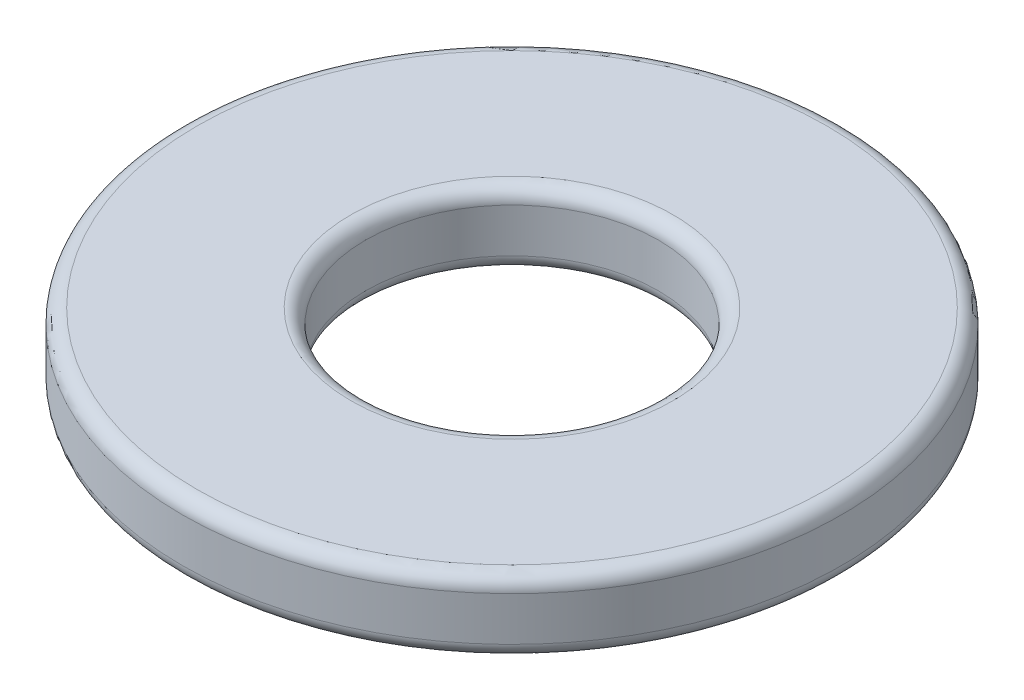
ISO-10303-21;
HEADER;
FILE_DESCRIPTION(('STEP AP214'),'2;1');
FILE_NAME('part.step','',(''),(''),'','','');
FILE_SCHEMA(('AUTOMOTIVE_DESIGN { 1 0 10303 214 1 1 1 1 }'));
ENDSEC;
DATA;
#1=APPLICATION_CONTEXT('core data for automotive mechanical design processes');
#2=APPLICATION_PROTOCOL_DEFINITION('international standard','automotive_design',2000,#1);
#3=PRODUCT_CONTEXT('',#1,'mechanical');
#4=PRODUCT('Part','Part','',(#3));
#5=PRODUCT_RELATED_PRODUCT_CATEGORY('part','',(#4));
#6=PRODUCT_DEFINITION_FORMATION('','',#4);
#7=PRODUCT_DEFINITION_CONTEXT('part definition',#1,'design');
#8=PRODUCT_DEFINITION('design','',#6,#7);
#9=PRODUCT_DEFINITION_SHAPE('','',#8);
#10=(LENGTH_UNIT() NAMED_UNIT(*) SI_UNIT(.MILLI.,.METRE.));
#11=(NAMED_UNIT(*) PLANE_ANGLE_UNIT() SI_UNIT($,.RADIAN.));
#12=(NAMED_UNIT(*) SI_UNIT($,.STERADIAN.) SOLID_ANGLE_UNIT());
#13=UNCERTAINTY_MEASURE_WITH_UNIT(LENGTH_MEASURE(1.E-05),#10,'distance_accuracy_value','');
#14=(GEOMETRIC_REPRESENTATION_CONTEXT(3) GLOBAL_UNCERTAINTY_ASSIGNED_CONTEXT((#13)) GLOBAL_UNIT_ASSIGNED_CONTEXT((#10,
#11,#12)) REPRESENTATION_CONTEXT('',''));
#15=CARTESIAN_POINT('',(0.,0.,0.));
#16=DIRECTION('',(0.,0.,1.));
#17=DIRECTION('',(1.,0.,0.));
#18=AXIS2_PLACEMENT_3D('',#15,#16,#17);
#19=CARTESIAN_POINT('',(0.,1.,0.));
#20=DIRECTION('',(0.,1.,0.));
#21=DIRECTION('',(0.,0.,1.));
#22=AXIS2_PLACEMENT_3D('',#19,#20,#21);
#23=PLANE('',#22);
#24=CARTESIAN_POINT('',(0.,1.,0.));
#25=DIRECTION('',(0.,1.,0.));
#26=DIRECTION('',(0.,0.,1.));
#27=AXIS2_PLACEMENT_3D('',#24,#25,#26);
#28=CIRCLE('',#27,4.3);
#29=CARTESIAN_POINT('',(0.,1.,4.3));
#30=VERTEX_POINT('',#29);
#31=EDGE_CURVE('E46',#30,#30,#28,.T.);
#32=ORIENTED_EDGE('',*,*,#31,.T.);
#33=EDGE_LOOP('',(#32));
#34=FACE_BOUND('',#33,.T.);
#35=CARTESIAN_POINT('',(0.,1.,0.));
#36=DIRECTION('',(0.,1.,0.));
#37=DIRECTION('',(0.,0.,1.));
#38=AXIS2_PLACEMENT_3D('',#35,#36,#37);
#39=CIRCLE('',#38,2.2);
#40=CARTESIAN_POINT('',(0.,1.,2.2));
#41=VERTEX_POINT('',#40);
#42=EDGE_CURVE('E50',#41,#41,#39,.F.);
#43=ORIENTED_EDGE('',*,*,#42,.T.);
#44=EDGE_LOOP('',(#43));
#45=FACE_BOUND('',#44,.T.);
#46=ADVANCED_FACE('F35',(#34,#45),#23,.T.);
#47=CARTESIAN_POINT('',(0.,0.,0.));
#48=DIRECTION('',(0.,1.,0.));
#49=DIRECTION('',(0.,0.,1.));
#50=AXIS2_PLACEMENT_3D('',#47,#48,#49);
#51=PLANE('',#50);
#52=CARTESIAN_POINT('',(0.,0.,0.));
#53=DIRECTION('',(0.,1.,0.));
#54=DIRECTION('',(0.,0.,1.));
#55=AXIS2_PLACEMENT_3D('',#52,#53,#54);
#56=CIRCLE('',#55,4.3);
#57=CARTESIAN_POINT('',(0.,0.,4.3));
#58=VERTEX_POINT('',#57);
#59=EDGE_CURVE('E55',#58,#58,#56,.F.);
#60=ORIENTED_EDGE('',*,*,#59,.T.);
#61=EDGE_LOOP('',(#60));
#62=FACE_BOUND('',#61,.T.);
#63=CARTESIAN_POINT('',(0.,0.,0.));
#64=DIRECTION('',(0.,1.,0.));
#65=DIRECTION('',(0.,0.,1.));
#66=AXIS2_PLACEMENT_3D('',#63,#64,#65);
#67=CIRCLE('',#66,2.2);
#68=CARTESIAN_POINT('',(0.,0.,2.2));
#69=VERTEX_POINT('',#68);
#70=EDGE_CURVE('E58',#69,#69,#67,.T.);
#71=ORIENTED_EDGE('',*,*,#70,.T.);
#72=EDGE_LOOP('',(#71));
#73=FACE_BOUND('',#72,.T.);
#74=ADVANCED_FACE('F80',(#62,#73),#51,.F.);
#75=CARTESIAN_POINT('',(0.,1.,0.));
#76=DIRECTION('',(0.,-1.,0.));
#77=DIRECTION('',(0.,0.,-1.));
#78=AXIS2_PLACEMENT_3D('',#75,#76,#77);
#79=CYLINDRICAL_SURFACE('',#78,4.5);
#80=CARTESIAN_POINT('',(0.,0.2,0.));
#81=DIRECTION('',(0.,1.,0.));
#82=DIRECTION('',(0.,0.,1.));
#83=AXIS2_PLACEMENT_3D('',#80,#81,#82);
#84=CIRCLE('',#83,4.5);
#85=CARTESIAN_POINT('',(0.,0.2,4.5));
#86=VERTEX_POINT('',#85);
#87=EDGE_CURVE('E61',#86,#86,#84,.T.);
#88=ORIENTED_EDGE('',*,*,#87,.T.);
#89=EDGE_LOOP('',(#88));
#90=FACE_BOUND('',#89,.T.);
#91=CARTESIAN_POINT('',(0.,0.8,0.));
#92=DIRECTION('',(0.,1.,0.));
#93=DIRECTION('',(0.,0.,1.));
#94=AXIS2_PLACEMENT_3D('',#91,#92,#93);
#95=CIRCLE('',#94,4.5);
#96=CARTESIAN_POINT('',(0.,0.8,4.5));
#97=VERTEX_POINT('',#96);
#98=EDGE_CURVE('E64',#97,#97,#95,.F.);
#99=ORIENTED_EDGE('',*,*,#98,.T.);
#100=EDGE_LOOP('',(#99));
#101=FACE_BOUND('',#100,.T.);
#102=ADVANCED_FACE('F68',(#90,#101),#79,.T.);
#103=CARTESIAN_POINT('',(0.,1.,0.));
#104=DIRECTION('',(0.,-1.,0.));
#105=DIRECTION('',(0.,0.,-1.));
#106=AXIS2_PLACEMENT_3D('',#103,#104,#105);
#107=CYLINDRICAL_SURFACE('',#106,2.);
#108=CARTESIAN_POINT('',(0.,0.2,0.));
#109=DIRECTION('',(0.,1.,0.));
#110=DIRECTION('',(0.,0.,1.));
#111=AXIS2_PLACEMENT_3D('',#108,#109,#110);
#112=CIRCLE('',#111,2.);
#113=CARTESIAN_POINT('',(0.,0.2,2.));
#114=VERTEX_POINT('',#113);
#115=EDGE_CURVE('E10',#114,#114,#112,.F.);
#116=ORIENTED_EDGE('',*,*,#115,.T.);
#117=EDGE_LOOP('',(#116));
#118=FACE_BOUND('',#117,.T.);
#119=CARTESIAN_POINT('',(0.,0.8,0.));
#120=DIRECTION('',(0.,1.,0.));
#121=DIRECTION('',(0.,0.,1.));
#122=AXIS2_PLACEMENT_3D('',#119,#120,#121);
#123=CIRCLE('',#122,2.);
#124=CARTESIAN_POINT('',(0.,0.8,2.));
#125=VERTEX_POINT('',#124);
#126=EDGE_CURVE('E42',#125,#125,#123,.T.);
#127=ORIENTED_EDGE('',*,*,#126,.T.);
#128=EDGE_LOOP('',(#127));
#129=FACE_BOUND('',#128,.T.);
#130=ADVANCED_FACE('F96',(#118,#129),#107,.F.);
#131=CARTESIAN_POINT('',(0.,0.2,0.));
#132=DIRECTION('',(0.,1.,0.));
#133=DIRECTION('',(0.,0.,1.));
#134=AXIS2_PLACEMENT_3D('',#131,#132,#133);
#135=TOROIDAL_SURFACE('',#134,4.3,0.2);
#136=ORIENTED_EDGE('',*,*,#59,.F.);
#137=EDGE_LOOP('',(#136));
#138=FACE_BOUND('',#137,.T.);
#139=ORIENTED_EDGE('',*,*,#87,.F.);
#140=EDGE_LOOP('',(#139));
#141=FACE_BOUND('',#140,.T.);
#142=ADVANCED_FACE('F74',(#138,#141),#135,.T.);
#143=CARTESIAN_POINT('',(0.,0.8,0.));
#144=DIRECTION('',(0.,1.,0.));
#145=DIRECTION('',(0.,0.,1.));
#146=AXIS2_PLACEMENT_3D('',#143,#144,#145);
#147=TOROIDAL_SURFACE('',#146,4.3,0.2);
#148=ORIENTED_EDGE('',*,*,#98,.F.);
#149=EDGE_LOOP('',(#148));
#150=FACE_BOUND('',#149,.T.);
#151=ORIENTED_EDGE('',*,*,#31,.F.);
#152=EDGE_LOOP('',(#151));
#153=FACE_BOUND('',#152,.T.);
#154=ADVANCED_FACE('F70',(#150,#153),#147,.T.);
#155=CARTESIAN_POINT('',(0.,0.2,0.));
#156=DIRECTION('',(0.,1.,0.));
#157=DIRECTION('',(0.,0.,1.));
#158=AXIS2_PLACEMENT_3D('',#155,#156,#157);
#159=TOROIDAL_SURFACE('',#158,2.2,0.2);
#160=ORIENTED_EDGE('',*,*,#115,.F.);
#161=EDGE_LOOP('',(#160));
#162=FACE_BOUND('',#161,.T.);
#163=ORIENTED_EDGE('',*,*,#70,.F.);
#164=EDGE_LOOP('',(#163));
#165=FACE_BOUND('',#164,.T.);
#166=ADVANCED_FACE('F73',(#162,#165),#159,.T.);
#167=CARTESIAN_POINT('',(0.,0.8,0.));
#168=DIRECTION('',(0.,1.,0.));
#169=DIRECTION('',(0.,0.,1.));
#170=AXIS2_PLACEMENT_3D('',#167,#168,#169);
#171=TOROIDAL_SURFACE('',#170,2.2,0.2);
#172=ORIENTED_EDGE('',*,*,#42,.F.);
#173=EDGE_LOOP('',(#172));
#174=FACE_BOUND('',#173,.T.);
#175=ORIENTED_EDGE('',*,*,#126,.F.);
#176=EDGE_LOOP('',(#175));
#177=FACE_BOUND('',#176,.T.);
#178=ADVANCED_FACE('F37',(#174,#177),#171,.T.);
#179=CLOSED_SHELL('',(#46,#74,#102,#130,#142,#154,#166,#178));
#180=MANIFOLD_SOLID_BREP('B2',#179);
#181=ADVANCED_BREP_SHAPE_REPRESENTATION('',(#18,#180),#14);
#182=SHAPE_DEFINITION_REPRESENTATION(#9,#181);
ENDSEC;
END-ISO-10303-21;
